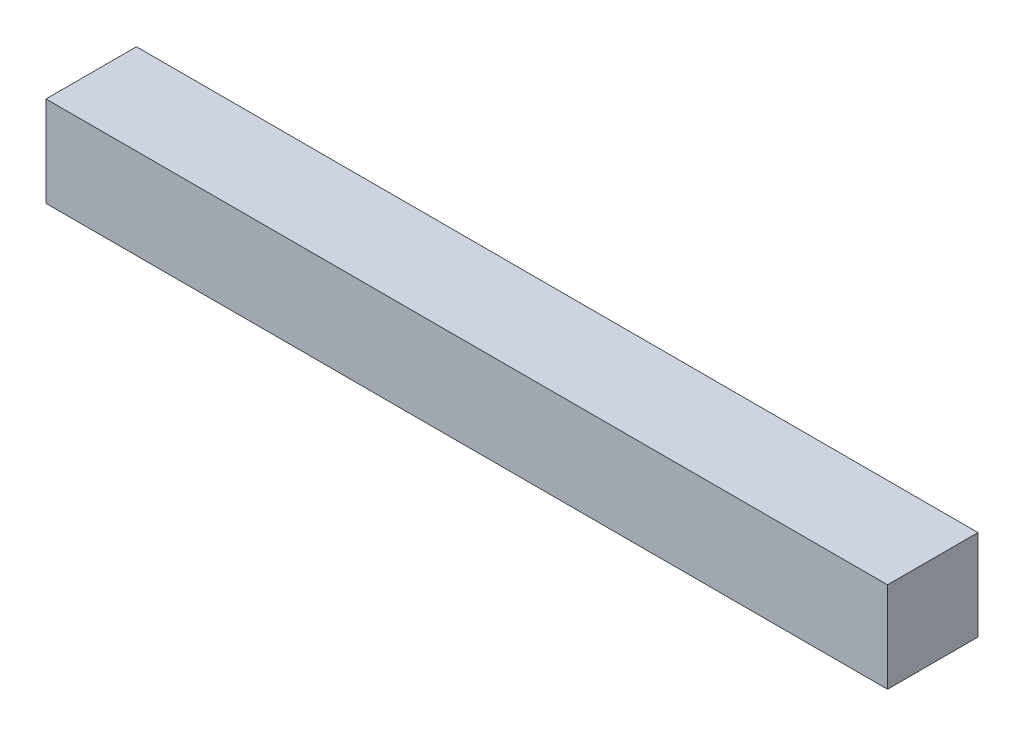
ISO-10303-21;
HEADER;
FILE_DESCRIPTION(('STEP AP214'),'2;1');
FILE_NAME('part.step','',(''),(''),'','','');
FILE_SCHEMA(('AUTOMOTIVE_DESIGN { 1 0 10303 214 1 1 1 1 }'));
ENDSEC;
DATA;
#1=APPLICATION_CONTEXT('core data for automotive mechanical design processes');
#2=APPLICATION_PROTOCOL_DEFINITION('international standard','automotive_design',2000,#1);
#3=PRODUCT_CONTEXT('',#1,'mechanical');
#4=PRODUCT('Part','Part','',(#3));
#5=PRODUCT_RELATED_PRODUCT_CATEGORY('part','',(#4));
#6=PRODUCT_DEFINITION_FORMATION('','',#4);
#7=PRODUCT_DEFINITION_CONTEXT('part definition',#1,'design');
#8=PRODUCT_DEFINITION('design','',#6,#7);
#9=PRODUCT_DEFINITION_SHAPE('','',#8);
#10=(LENGTH_UNIT() NAMED_UNIT(*) SI_UNIT(.MILLI.,.METRE.));
#11=(NAMED_UNIT(*) PLANE_ANGLE_UNIT() SI_UNIT($,.RADIAN.));
#12=(NAMED_UNIT(*) SI_UNIT($,.STERADIAN.) SOLID_ANGLE_UNIT());
#13=UNCERTAINTY_MEASURE_WITH_UNIT(LENGTH_MEASURE(1.E-05),#10,'distance_accuracy_value','');
#14=(GEOMETRIC_REPRESENTATION_CONTEXT(3) GLOBAL_UNCERTAINTY_ASSIGNED_CONTEXT((#13)) GLOBAL_UNIT_ASSIGNED_CONTEXT((#10,
#11,#12)) REPRESENTATION_CONTEXT('',''));
#15=CARTESIAN_POINT('',(0.,0.,0.));
#16=DIRECTION('',(0.,0.,1.));
#17=DIRECTION('',(1.,0.,0.));
#18=AXIS2_PLACEMENT_3D('',#15,#16,#17);
#19=CARTESIAN_POINT('',(0.,215.,215.));
#20=DIRECTION('',(1.,0.,0.));
#21=DIRECTION('',(0.,1.,0.));
#22=AXIS2_PLACEMENT_3D('',#19,#20,#21);
#23=PLANE('',#22);
#24=DIRECTION('',(0.,-1.,0.));
#25=VECTOR('',#24,1.);
#26=CARTESIAN_POINT('',(0.,215.,0.));
#27=LINE('',#26,#25);
#28=CARTESIAN_POINT('',(0.,215.,0.));
#29=VERTEX_POINT('',#28);
#30=CARTESIAN_POINT('',(0.,0.,0.));
#31=VERTEX_POINT('',#30);
#32=EDGE_CURVE('E97',#29,#31,#27,.T.);
#33=ORIENTED_EDGE('',*,*,#32,.T.);
#34=DIRECTION('',(0.,0.,-1.));
#35=VECTOR('',#34,1.);
#36=CARTESIAN_POINT('',(0.,0.,215.));
#37=LINE('',#36,#35);
#38=CARTESIAN_POINT('',(0.,0.,215.));
#39=VERTEX_POINT('',#38);
#40=EDGE_CURVE('E11',#39,#31,#37,.T.);
#41=ORIENTED_EDGE('',*,*,#40,.F.);
#42=DIRECTION('',(0.,-1.,0.));
#43=VECTOR('',#42,1.);
#44=CARTESIAN_POINT('',(0.,215.,215.));
#45=LINE('',#44,#43);
#46=CARTESIAN_POINT('',(0.,215.,215.));
#47=VERTEX_POINT('',#46);
#48=EDGE_CURVE('E85',#47,#39,#45,.T.);
#49=ORIENTED_EDGE('',*,*,#48,.F.);
#50=DIRECTION('',(0.,0.,-1.));
#51=VECTOR('',#50,1.);
#52=CARTESIAN_POINT('',(0.,215.,215.));
#53=LINE('',#52,#51);
#54=EDGE_CURVE('E93',#47,#29,#53,.T.);
#55=ORIENTED_EDGE('',*,*,#54,.T.);
#56=EDGE_LOOP('',(#33,#41,#49,#55));
#57=FACE_BOUND('',#56,.T.);
#58=ADVANCED_FACE('F34',(#57),#23,.F.);
#59=CARTESIAN_POINT('',(0.,0.,215.));
#60=DIRECTION('',(0.,1.,0.));
#61=DIRECTION('',(0.,0.,1.));
#62=AXIS2_PLACEMENT_3D('',#59,#60,#61);
#63=PLANE('',#62);
#64=DIRECTION('',(1.,0.,0.));
#65=VECTOR('',#64,1.);
#66=CARTESIAN_POINT('',(0.,0.,0.));
#67=LINE('',#66,#65);
#68=CARTESIAN_POINT('',(2000.,0.,0.));
#69=VERTEX_POINT('',#68);
#70=EDGE_CURVE('E89',#31,#69,#67,.T.);
#71=ORIENTED_EDGE('',*,*,#70,.T.);
#72=DIRECTION('',(0.,0.,-1.));
#73=VECTOR('',#72,1.);
#74=CARTESIAN_POINT('',(2000.,0.,215.));
#75=LINE('',#74,#73);
#76=CARTESIAN_POINT('',(2000.,0.,215.));
#77=VERTEX_POINT('',#76);
#78=EDGE_CURVE('E42',#77,#69,#75,.T.);
#79=ORIENTED_EDGE('',*,*,#78,.F.);
#80=DIRECTION('',(1.,0.,0.));
#81=VECTOR('',#80,1.);
#82=CARTESIAN_POINT('',(0.,0.,215.));
#83=LINE('',#82,#81);
#84=EDGE_CURVE('E80',#39,#77,#83,.T.);
#85=ORIENTED_EDGE('',*,*,#84,.F.);
#86=ORIENTED_EDGE('',*,*,#40,.T.);
#87=EDGE_LOOP('',(#71,#79,#85,#86));
#88=FACE_BOUND('',#87,.T.);
#89=ADVANCED_FACE('F88',(#88),#63,.F.);
#90=CARTESIAN_POINT('',(2000.,215.,215.));
#91=DIRECTION('',(-1.,0.,0.));
#92=DIRECTION('',(0.,0.,1.));
#93=AXIS2_PLACEMENT_3D('',#90,#91,#92);
#94=PLANE('',#93);
#95=DIRECTION('',(0.,1.,0.));
#96=VECTOR('',#95,1.);
#97=CARTESIAN_POINT('',(2000.,215.,0.));
#98=LINE('',#97,#96);
#99=CARTESIAN_POINT('',(2000.,215.,0.));
#100=VERTEX_POINT('',#99);
#101=EDGE_CURVE('E67',#69,#100,#98,.T.);
#102=ORIENTED_EDGE('',*,*,#101,.T.);
#103=DIRECTION('',(0.,0.,-1.));
#104=VECTOR('',#103,1.);
#105=CARTESIAN_POINT('',(2000.,215.,215.));
#106=LINE('',#105,#104);
#107=CARTESIAN_POINT('',(2000.,215.,215.));
#108=VERTEX_POINT('',#107);
#109=EDGE_CURVE('E90',#108,#100,#106,.T.);
#110=ORIENTED_EDGE('',*,*,#109,.F.);
#111=DIRECTION('',(0.,1.,0.));
#112=VECTOR('',#111,1.);
#113=CARTESIAN_POINT('',(2000.,215.,215.));
#114=LINE('',#113,#112);
#115=EDGE_CURVE('E83',#77,#108,#114,.T.);
#116=ORIENTED_EDGE('',*,*,#115,.F.);
#117=ORIENTED_EDGE('',*,*,#78,.T.);
#118=EDGE_LOOP('',(#102,#110,#116,#117));
#119=FACE_BOUND('',#118,.T.);
#120=ADVANCED_FACE('F91',(#119),#94,.F.);
#121=CARTESIAN_POINT('',(0.,215.,215.));
#122=DIRECTION('',(0.,-1.,0.));
#123=DIRECTION('',(0.,0.,-1.));
#124=AXIS2_PLACEMENT_3D('',#121,#122,#123);
#125=PLANE('',#124);
#126=DIRECTION('',(-1.,0.,0.));
#127=VECTOR('',#126,1.);
#128=CARTESIAN_POINT('',(0.,215.,0.));
#129=LINE('',#128,#127);
#130=EDGE_CURVE('E73',#100,#29,#129,.T.);
#131=ORIENTED_EDGE('',*,*,#130,.T.);
#132=ORIENTED_EDGE('',*,*,#54,.F.);
#133=DIRECTION('',(-1.,0.,0.));
#134=VECTOR('',#133,1.);
#135=CARTESIAN_POINT('',(0.,215.,215.));
#136=LINE('',#135,#134);
#137=EDGE_CURVE('E50',#108,#47,#136,.T.);
#138=ORIENTED_EDGE('',*,*,#137,.F.);
#139=ORIENTED_EDGE('',*,*,#109,.T.);
#140=EDGE_LOOP('',(#131,#132,#138,#139));
#141=FACE_BOUND('',#140,.T.);
#142=ADVANCED_FACE('F104',(#141),#125,.F.);
#143=CARTESIAN_POINT('',(0.,0.,215.));
#144=DIRECTION('',(0.,0.,1.));
#145=DIRECTION('',(1.,0.,0.));
#146=AXIS2_PLACEMENT_3D('',#143,#144,#145);
#147=PLANE('',#146);
#148=ORIENTED_EDGE('',*,*,#48,.T.);
#149=ORIENTED_EDGE('',*,*,#84,.T.);
#150=ORIENTED_EDGE('',*,*,#115,.T.);
#151=ORIENTED_EDGE('',*,*,#137,.T.);
#152=EDGE_LOOP('',(#148,#149,#150,#151));
#153=FACE_BOUND('',#152,.T.);
#154=ADVANCED_FACE('F81',(#153),#147,.T.);
#155=CARTESIAN_POINT('',(0.,0.,0.));
#156=DIRECTION('',(0.,0.,1.));
#157=DIRECTION('',(1.,0.,0.));
#158=AXIS2_PLACEMENT_3D('',#155,#156,#157);
#159=PLANE('',#158);
#160=ORIENTED_EDGE('',*,*,#32,.F.);
#161=ORIENTED_EDGE('',*,*,#130,.F.);
#162=ORIENTED_EDGE('',*,*,#101,.F.);
#163=ORIENTED_EDGE('',*,*,#70,.F.);
#164=EDGE_LOOP('',(#160,#161,#162,#163));
#165=FACE_BOUND('',#164,.T.);
#166=ADVANCED_FACE('F107',(#165),#159,.F.);
#167=CLOSED_SHELL('',(#58,#89,#120,#142,#154,#166));
#168=MANIFOLD_SOLID_BREP('B2',#167);
#169=ADVANCED_BREP_SHAPE_REPRESENTATION('',(#18,#168),#14);
#170=SHAPE_DEFINITION_REPRESENTATION(#9,#169);
ENDSEC;
END-ISO-10303-21;
